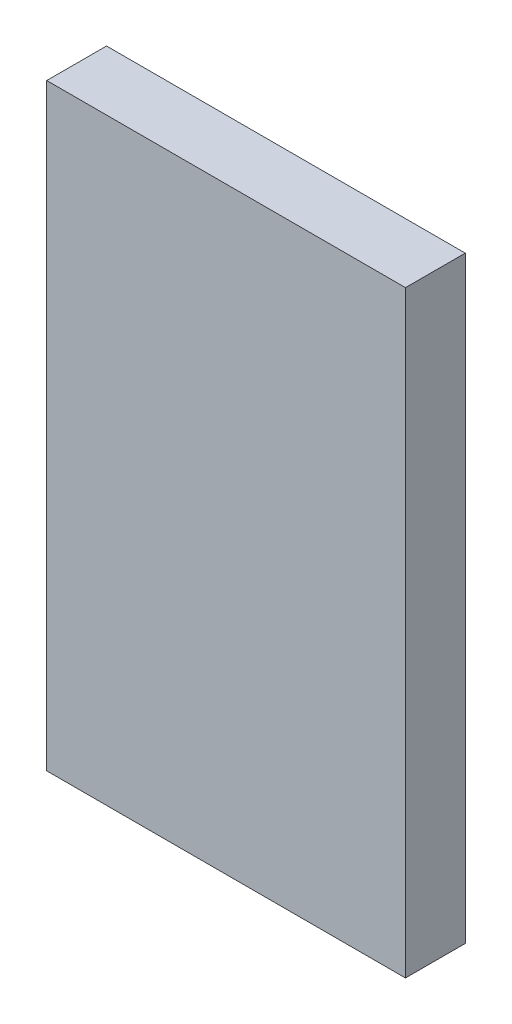
ISO-10303-21;
HEADER;
FILE_DESCRIPTION(('STEP AP214'),'2;1');
FILE_NAME('part.step','',(''),(''),'','','');
FILE_SCHEMA(('AUTOMOTIVE_DESIGN { 1 0 10303 214 1 1 1 1 }'));
ENDSEC;
DATA;
#1=APPLICATION_CONTEXT('core data for automotive mechanical design processes');
#2=APPLICATION_PROTOCOL_DEFINITION('international standard','automotive_design',2000,#1);
#3=PRODUCT_CONTEXT('',#1,'mechanical');
#4=PRODUCT('Part','Part','',(#3));
#5=PRODUCT_RELATED_PRODUCT_CATEGORY('part','',(#4));
#6=PRODUCT_DEFINITION_FORMATION('','',#4);
#7=PRODUCT_DEFINITION_CONTEXT('part definition',#1,'design');
#8=PRODUCT_DEFINITION('design','',#6,#7);
#9=PRODUCT_DEFINITION_SHAPE('','',#8);
#10=(LENGTH_UNIT() NAMED_UNIT(*) SI_UNIT(.MILLI.,.METRE.));
#11=(NAMED_UNIT(*) PLANE_ANGLE_UNIT() SI_UNIT($,.RADIAN.));
#12=(NAMED_UNIT(*) SI_UNIT($,.STERADIAN.) SOLID_ANGLE_UNIT());
#13=UNCERTAINTY_MEASURE_WITH_UNIT(LENGTH_MEASURE(1.E-05),#10,'distance_accuracy_value','');
#14=(GEOMETRIC_REPRESENTATION_CONTEXT(3) GLOBAL_UNCERTAINTY_ASSIGNED_CONTEXT((#13)) GLOBAL_UNIT_ASSIGNED_CONTEXT((#10,
#11,#12)) REPRESENTATION_CONTEXT('',''));
#15=CARTESIAN_POINT('',(0.,0.,0.));
#16=DIRECTION('',(0.,0.,1.));
#17=DIRECTION('',(1.,0.,0.));
#18=AXIS2_PLACEMENT_3D('',#15,#16,#17);
#19=CARTESIAN_POINT('',(-19.05,31.75,3.175));
#20=DIRECTION('',(1.,0.,0.));
#21=DIRECTION('',(0.,0.,-1.));
#22=AXIS2_PLACEMENT_3D('',#19,#20,#21);
#23=PLANE('',#22);
#24=DIRECTION('',(0.,-1.,0.));
#25=VECTOR('',#24,1.);
#26=CARTESIAN_POINT('',(-19.05,31.75,-3.175));
#27=LINE('',#26,#25);
#28=CARTESIAN_POINT('',(-19.05,31.75,-3.175));
#29=VERTEX_POINT('',#28);
#30=CARTESIAN_POINT('',(-19.05,-31.75,-3.175));
#31=VERTEX_POINT('',#30);
#32=EDGE_CURVE('E107',#29,#31,#27,.T.);
#33=ORIENTED_EDGE('',*,*,#32,.T.);
#34=DIRECTION('',(0.,0.,-1.));
#35=VECTOR('',#34,1.);
#36=CARTESIAN_POINT('',(-19.05,-31.75,3.175));
#37=LINE('',#36,#35);
#38=CARTESIAN_POINT('',(-19.05,-31.75,3.175));
#39=VERTEX_POINT('',#38);
#40=EDGE_CURVE('E11',#39,#31,#37,.T.);
#41=ORIENTED_EDGE('',*,*,#40,.F.);
#42=DIRECTION('',(0.,-1.,0.));
#43=VECTOR('',#42,1.);
#44=CARTESIAN_POINT('',(-19.05,31.75,3.175));
#45=LINE('',#44,#43);
#46=CARTESIAN_POINT('',(-19.05,31.75,3.175));
#47=VERTEX_POINT('',#46);
#48=EDGE_CURVE('E91',#47,#39,#45,.T.);
#49=ORIENTED_EDGE('',*,*,#48,.F.);
#50=DIRECTION('',(0.,0.,-1.));
#51=VECTOR('',#50,1.);
#52=CARTESIAN_POINT('',(-19.05,31.75,3.175));
#53=LINE('',#52,#51);
#54=EDGE_CURVE('E103',#47,#29,#53,.T.);
#55=ORIENTED_EDGE('',*,*,#54,.T.);
#56=EDGE_LOOP('',(#33,#41,#49,#55));
#57=FACE_BOUND('',#56,.T.);
#58=ADVANCED_FACE('F39',(#57),#23,.F.);
#59=CARTESIAN_POINT('',(-19.05,-31.75,3.175));
#60=DIRECTION('',(0.,1.,0.));
#61=DIRECTION('',(0.,0.,1.));
#62=AXIS2_PLACEMENT_3D('',#59,#60,#61);
#63=PLANE('',#62);
#64=DIRECTION('',(1.,0.,0.));
#65=VECTOR('',#64,1.);
#66=CARTESIAN_POINT('',(-19.05,-31.75,-3.175));
#67=LINE('',#66,#65);
#68=CARTESIAN_POINT('',(19.05,-31.75,-3.175));
#69=VERTEX_POINT('',#68);
#70=EDGE_CURVE('E96',#31,#69,#67,.T.);
#71=ORIENTED_EDGE('',*,*,#70,.T.);
#72=DIRECTION('',(0.,0.,-1.));
#73=VECTOR('',#72,1.);
#74=CARTESIAN_POINT('',(19.05,-31.75,3.175));
#75=LINE('',#74,#73);
#76=CARTESIAN_POINT('',(19.05,-31.75,3.175));
#77=VERTEX_POINT('',#76);
#78=EDGE_CURVE('E48',#77,#69,#75,.T.);
#79=ORIENTED_EDGE('',*,*,#78,.F.);
#80=DIRECTION('',(1.,0.,0.));
#81=VECTOR('',#80,1.);
#82=CARTESIAN_POINT('',(-19.05,-31.75,3.175));
#83=LINE('',#82,#81);
#84=EDGE_CURVE('E86',#39,#77,#83,.T.);
#85=ORIENTED_EDGE('',*,*,#84,.F.);
#86=ORIENTED_EDGE('',*,*,#40,.T.);
#87=EDGE_LOOP('',(#71,#79,#85,#86));
#88=FACE_BOUND('',#87,.T.);
#89=ADVANCED_FACE('F95',(#88),#63,.F.);
#90=CARTESIAN_POINT('',(19.05,31.75,3.175));
#91=DIRECTION('',(-1.,0.,0.));
#92=DIRECTION('',(0.,0.,1.));
#93=AXIS2_PLACEMENT_3D('',#90,#91,#92);
#94=PLANE('',#93);
#95=DIRECTION('',(0.,1.,0.));
#96=VECTOR('',#95,1.);
#97=CARTESIAN_POINT('',(19.05,31.75,-3.175));
#98=LINE('',#97,#96);
#99=CARTESIAN_POINT('',(19.05,31.75,-3.175));
#100=VERTEX_POINT('',#99);
#101=EDGE_CURVE('E73',#69,#100,#98,.T.);
#102=ORIENTED_EDGE('',*,*,#101,.T.);
#103=DIRECTION('',(0.,0.,-1.));
#104=VECTOR('',#103,1.);
#105=CARTESIAN_POINT('',(19.05,31.75,3.175));
#106=LINE('',#105,#104);
#107=CARTESIAN_POINT('',(19.05,31.75,3.175));
#108=VERTEX_POINT('',#107);
#109=EDGE_CURVE('E98',#108,#100,#106,.T.);
#110=ORIENTED_EDGE('',*,*,#109,.F.);
#111=DIRECTION('',(0.,1.,0.));
#112=VECTOR('',#111,1.);
#113=CARTESIAN_POINT('',(19.05,31.75,3.175));
#114=LINE('',#113,#112);
#115=EDGE_CURVE('E89',#77,#108,#114,.T.);
#116=ORIENTED_EDGE('',*,*,#115,.F.);
#117=ORIENTED_EDGE('',*,*,#78,.T.);
#118=EDGE_LOOP('',(#102,#110,#116,#117));
#119=FACE_BOUND('',#118,.T.);
#120=ADVANCED_FACE('F99',(#119),#94,.F.);
#121=CARTESIAN_POINT('',(-19.05,31.75,3.175));
#122=DIRECTION('',(0.,-1.,0.));
#123=DIRECTION('',(0.,0.,-1.));
#124=AXIS2_PLACEMENT_3D('',#121,#122,#123);
#125=PLANE('',#124);
#126=DIRECTION('',(-1.,0.,0.));
#127=VECTOR('',#126,1.);
#128=CARTESIAN_POINT('',(-19.05,31.75,-3.175));
#129=LINE('',#128,#127);
#130=EDGE_CURVE('E79',#100,#29,#129,.T.);
#131=ORIENTED_EDGE('',*,*,#130,.T.);
#132=ORIENTED_EDGE('',*,*,#54,.F.);
#133=DIRECTION('',(-1.,0.,0.));
#134=VECTOR('',#133,1.);
#135=CARTESIAN_POINT('',(-19.05,31.75,3.175));
#136=LINE('',#135,#134);
#137=EDGE_CURVE('E56',#108,#47,#136,.T.);
#138=ORIENTED_EDGE('',*,*,#137,.F.);
#139=ORIENTED_EDGE('',*,*,#109,.T.);
#140=EDGE_LOOP('',(#131,#132,#138,#139));
#141=FACE_BOUND('',#140,.T.);
#142=ADVANCED_FACE('F120',(#141),#125,.F.);
#143=CARTESIAN_POINT('',(0.,0.,3.175));
#144=DIRECTION('',(0.,0.,1.));
#145=DIRECTION('',(1.,0.,0.));
#146=AXIS2_PLACEMENT_3D('',#143,#144,#145);
#147=PLANE('',#146);
#148=ORIENTED_EDGE('',*,*,#48,.T.);
#149=ORIENTED_EDGE('',*,*,#84,.T.);
#150=ORIENTED_EDGE('',*,*,#115,.T.);
#151=ORIENTED_EDGE('',*,*,#137,.T.);
#152=EDGE_LOOP('',(#148,#149,#150,#151));
#153=FACE_BOUND('',#152,.T.);
#154=ADVANCED_FACE('F87',(#153),#147,.T.);
#155=CARTESIAN_POINT('',(0.,0.,-3.175));
#156=DIRECTION('',(0.,0.,1.));
#157=DIRECTION('',(1.,0.,0.));
#158=AXIS2_PLACEMENT_3D('',#155,#156,#157);
#159=PLANE('',#158);
#160=ORIENTED_EDGE('',*,*,#32,.F.);
#161=ORIENTED_EDGE('',*,*,#130,.F.);
#162=ORIENTED_EDGE('',*,*,#101,.F.);
#163=ORIENTED_EDGE('',*,*,#70,.F.);
#164=EDGE_LOOP('',(#160,#161,#162,#163));
#165=FACE_BOUND('',#164,.T.);
#166=ADVANCED_FACE('F123',(#165),#159,.F.);
#167=CLOSED_SHELL('',(#58,#89,#120,#142,#154,#166));
#168=MANIFOLD_SOLID_BREP('B2',#167);
#169=ADVANCED_BREP_SHAPE_REPRESENTATION('',(#18,#168),#14);
#170=SHAPE_DEFINITION_REPRESENTATION(#9,#169);
ENDSEC;
END-ISO-10303-21;
